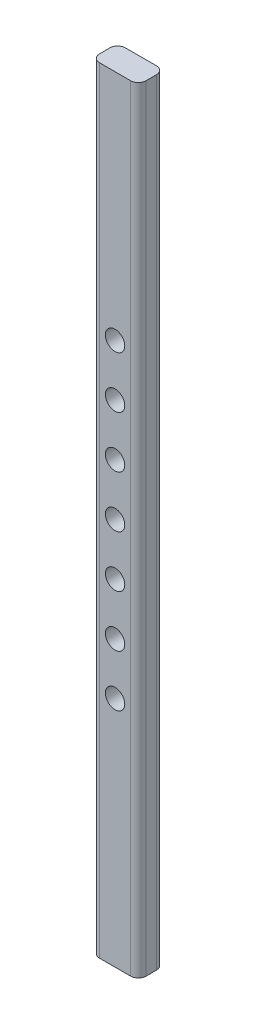
ISO-10303-21;
HEADER;
FILE_DESCRIPTION(('STEP AP214'),'2;1');
FILE_NAME('part.step','',(''),(''),'','','');
FILE_SCHEMA(('AUTOMOTIVE_DESIGN { 1 0 10303 214 1 1 1 1 }'));
ENDSEC;
DATA;
#1=APPLICATION_CONTEXT('core data for automotive mechanical design processes');
#2=APPLICATION_PROTOCOL_DEFINITION('international standard','automotive_design',2000,#1);
#3=PRODUCT_CONTEXT('',#1,'mechanical');
#4=PRODUCT('Part','Part','',(#3));
#5=PRODUCT_RELATED_PRODUCT_CATEGORY('part','',(#4));
#6=PRODUCT_DEFINITION_FORMATION('','',#4);
#7=PRODUCT_DEFINITION_CONTEXT('part definition',#1,'design');
#8=PRODUCT_DEFINITION('design','',#6,#7);
#9=PRODUCT_DEFINITION_SHAPE('','',#8);
#10=(LENGTH_UNIT() NAMED_UNIT(*) SI_UNIT(.MILLI.,.METRE.));
#11=(NAMED_UNIT(*) PLANE_ANGLE_UNIT() SI_UNIT($,.RADIAN.));
#12=(NAMED_UNIT(*) SI_UNIT($,.STERADIAN.) SOLID_ANGLE_UNIT());
#13=UNCERTAINTY_MEASURE_WITH_UNIT(LENGTH_MEASURE(1.E-05),#10,'distance_accuracy_value','');
#14=(GEOMETRIC_REPRESENTATION_CONTEXT(3) GLOBAL_UNCERTAINTY_ASSIGNED_CONTEXT((#13)) GLOBAL_UNIT_ASSIGNED_CONTEXT((#10,
#11,#12)) REPRESENTATION_CONTEXT('',''));
#15=CARTESIAN_POINT('',(0.,0.,0.));
#16=DIRECTION('',(0.,0.,1.));
#17=DIRECTION('',(1.,0.,0.));
#18=AXIS2_PLACEMENT_3D('',#15,#16,#17);
#19=CARTESIAN_POINT('',(8.99999999999998,150.,5.));
#20=DIRECTION('',(-1.,0.,0.));
#21=DIRECTION('',(0.,-1.,0.));
#22=AXIS2_PLACEMENT_3D('',#19,#20,#21);
#23=PLANE('',#22);
#24=DIRECTION('',(0.,0.,-1.));
#25=VECTOR('',#24,1.);
#26=CARTESIAN_POINT('',(8.99999999999998,150.,5.));
#27=LINE('',#26,#25);
#28=CARTESIAN_POINT('',(8.99999999999998,150.,2.));
#29=VERTEX_POINT('',#28);
#30=CARTESIAN_POINT('',(8.99999999999998,150.,-2.));
#31=VERTEX_POINT('',#30);
#32=EDGE_CURVE('E121',#29,#31,#27,.T.);
#33=ORIENTED_EDGE('',*,*,#32,.F.);
#34=DIRECTION('',(0.,1.,0.));
#35=VECTOR('',#34,1.);
#36=CARTESIAN_POINT('',(9.00000000000002,-150.,2.));
#37=LINE('',#36,#35);
#38=CARTESIAN_POINT('',(9.00000000000002,-150.,2.));
#39=VERTEX_POINT('',#38);
#40=EDGE_CURVE('E11',#29,#39,#37,.F.);
#41=ORIENTED_EDGE('',*,*,#40,.T.);
#42=DIRECTION('',(0.,0.,-1.));
#43=VECTOR('',#42,1.);
#44=CARTESIAN_POINT('',(9.00000000000002,-150.,5.));
#45=LINE('',#44,#43);
#46=CARTESIAN_POINT('',(9.00000000000002,-150.,-2.));
#47=VERTEX_POINT('',#46);
#48=EDGE_CURVE('E129',#39,#47,#45,.T.);
#49=ORIENTED_EDGE('',*,*,#48,.T.);
#50=DIRECTION('',(0.,1.,0.));
#51=VECTOR('',#50,1.);
#52=CARTESIAN_POINT('',(8.99999999999998,150.,-2.));
#53=LINE('',#52,#51);
#54=EDGE_CURVE('E47',#47,#31,#53,.T.);
#55=ORIENTED_EDGE('',*,*,#54,.T.);
#56=EDGE_LOOP('',(#33,#41,#49,#55));
#57=FACE_BOUND('',#56,.T.);
#58=ADVANCED_FACE('F39',(#57),#23,.F.);
#59=CARTESIAN_POINT('',(-9.00000000000002,150.,5.));
#60=DIRECTION('',(0.,-1.,0.));
#61=DIRECTION('',(0.,0.,-1.));
#62=AXIS2_PLACEMENT_3D('',#59,#60,#61);
#63=PLANE('',#62);
#64=DIRECTION('',(0.,0.,-1.));
#65=VECTOR('',#64,1.);
#66=CARTESIAN_POINT('',(-9.00000000000002,150.,5.));
#67=LINE('',#66,#65);
#68=CARTESIAN_POINT('',(-9.00000000000002,150.,2.));
#69=VERTEX_POINT('',#68);
#70=CARTESIAN_POINT('',(-9.00000000000002,150.,-2.));
#71=VERTEX_POINT('',#70);
#72=EDGE_CURVE('E146',#69,#71,#67,.T.);
#73=ORIENTED_EDGE('',*,*,#72,.F.);
#74=CARTESIAN_POINT('',(-6.00000000000002,150.,2.));
#75=DIRECTION('',(0.,-1.,0.));
#76=DIRECTION('',(0.,0.,-1.));
#77=AXIS2_PLACEMENT_3D('',#74,#75,#76);
#78=CIRCLE('',#77,3.);
#79=CARTESIAN_POINT('',(-6.00000000000002,150.,5.));
#80=VERTEX_POINT('',#79);
#81=EDGE_CURVE('E126',#69,#80,#78,.F.);
#82=ORIENTED_EDGE('',*,*,#81,.T.);
#83=DIRECTION('',(-1.,0.,0.));
#84=VECTOR('',#83,1.);
#85=CARTESIAN_POINT('',(-9.00000000000002,150.,5.));
#86=LINE('',#85,#84);
#87=CARTESIAN_POINT('',(5.99999999999998,150.,5.));
#88=VERTEX_POINT('',#87);
#89=EDGE_CURVE('E116',#88,#80,#86,.T.);
#90=ORIENTED_EDGE('',*,*,#89,.F.);
#91=CARTESIAN_POINT('',(5.99999999999998,150.,2.));
#92=DIRECTION('',(0.,-1.,0.));
#93=DIRECTION('',(0.,0.,-1.));
#94=AXIS2_PLACEMENT_3D('',#91,#92,#93);
#95=CIRCLE('',#94,3.);
#96=EDGE_CURVE('E62',#88,#29,#95,.F.);
#97=ORIENTED_EDGE('',*,*,#96,.T.);
#98=ORIENTED_EDGE('',*,*,#32,.T.);
#99=CARTESIAN_POINT('',(5.99999999999998,150.,-2.));
#100=DIRECTION('',(0.,-1.,0.));
#101=DIRECTION('',(0.,0.,-1.));
#102=AXIS2_PLACEMENT_3D('',#99,#100,#101);
#103=CIRCLE('',#102,3.);
#104=CARTESIAN_POINT('',(5.99999999999998,150.,-5.));
#105=VERTEX_POINT('',#104);
#106=EDGE_CURVE('E54',#31,#105,#103,.F.);
#107=ORIENTED_EDGE('',*,*,#106,.T.);
#108=DIRECTION('',(-1.,0.,0.));
#109=VECTOR('',#108,1.);
#110=CARTESIAN_POINT('',(-9.00000000000002,150.,-5.));
#111=LINE('',#110,#109);
#112=CARTESIAN_POINT('',(-6.00000000000002,150.,-5.));
#113=VERTEX_POINT('',#112);
#114=EDGE_CURVE('E132',#105,#113,#111,.T.);
#115=ORIENTED_EDGE('',*,*,#114,.T.);
#116=CARTESIAN_POINT('',(-6.00000000000002,150.,-2.));
#117=DIRECTION('',(0.,-1.,0.));
#118=DIRECTION('',(0.,0.,-1.));
#119=AXIS2_PLACEMENT_3D('',#116,#117,#118);
#120=CIRCLE('',#119,3.);
#121=EDGE_CURVE('E109',#113,#71,#120,.F.);
#122=ORIENTED_EDGE('',*,*,#121,.T.);
#123=EDGE_LOOP('',(#73,#82,#90,#97,#98,#107,#115,#122));
#124=FACE_BOUND('',#123,.T.);
#125=ADVANCED_FACE('F124',(#124),#63,.F.);
#126=CARTESIAN_POINT('',(-9.00000000000002,150.,5.));
#127=DIRECTION('',(1.,0.,0.));
#128=DIRECTION('',(0.,1.,0.));
#129=AXIS2_PLACEMENT_3D('',#126,#127,#128);
#130=PLANE('',#129);
#131=DIRECTION('',(0.,0.,-1.));
#132=VECTOR('',#131,1.);
#133=CARTESIAN_POINT('',(-8.99999999999998,-150.,5.));
#134=LINE('',#133,#132);
#135=CARTESIAN_POINT('',(-8.99999999999998,-150.,2.));
#136=VERTEX_POINT('',#135);
#137=CARTESIAN_POINT('',(-8.99999999999998,-150.,-2.));
#138=VERTEX_POINT('',#137);
#139=EDGE_CURVE('E143',#136,#138,#134,.T.);
#140=ORIENTED_EDGE('',*,*,#139,.F.);
#141=DIRECTION('',(0.,-1.,0.));
#142=VECTOR('',#141,1.);
#143=CARTESIAN_POINT('',(-9.00000000000002,150.,2.));
#144=LINE('',#143,#142);
#145=EDGE_CURVE('E162',#136,#69,#144,.F.);
#146=ORIENTED_EDGE('',*,*,#145,.T.);
#147=ORIENTED_EDGE('',*,*,#72,.T.);
#148=DIRECTION('',(0.,-1.,0.));
#149=VECTOR('',#148,1.);
#150=CARTESIAN_POINT('',(-9.00000000000002,150.,-2.));
#151=LINE('',#150,#149);
#152=EDGE_CURVE('E159',#71,#138,#151,.T.);
#153=ORIENTED_EDGE('',*,*,#152,.T.);
#154=EDGE_LOOP('',(#140,#146,#147,#153));
#155=FACE_BOUND('',#154,.T.);
#156=ADVANCED_FACE('F186',(#155),#130,.F.);
#157=CARTESIAN_POINT('',(-8.99999999999998,-150.,5.));
#158=DIRECTION('',(0.,1.,0.));
#159=DIRECTION('',(0.,0.,1.));
#160=AXIS2_PLACEMENT_3D('',#157,#158,#159);
#161=PLANE('',#160);
#162=DIRECTION('',(1.,0.,0.));
#163=VECTOR('',#162,1.);
#164=CARTESIAN_POINT('',(-8.99999999999998,-150.,5.));
#165=LINE('',#164,#163);
#166=CARTESIAN_POINT('',(-5.99999999999998,-150.,5.));
#167=VERTEX_POINT('',#166);
#168=CARTESIAN_POINT('',(6.00000000000002,-150.,5.));
#169=VERTEX_POINT('',#168);
#170=EDGE_CURVE('E119',#167,#169,#165,.T.);
#171=ORIENTED_EDGE('',*,*,#170,.F.);
#172=CARTESIAN_POINT('',(-5.99999999999998,-150.,2.));
#173=DIRECTION('',(0.,1.,0.));
#174=DIRECTION('',(0.,0.,1.));
#175=AXIS2_PLACEMENT_3D('',#172,#173,#174);
#176=CIRCLE('',#175,3.);
#177=EDGE_CURVE('E157',#167,#136,#176,.F.);
#178=ORIENTED_EDGE('',*,*,#177,.T.);
#179=ORIENTED_EDGE('',*,*,#139,.T.);
#180=CARTESIAN_POINT('',(-5.99999999999998,-150.,-2.));
#181=DIRECTION('',(0.,1.,0.));
#182=DIRECTION('',(0.,0.,1.));
#183=AXIS2_PLACEMENT_3D('',#180,#181,#182);
#184=CIRCLE('',#183,3.);
#185=CARTESIAN_POINT('',(-5.99999999999998,-150.,-5.));
#186=VERTEX_POINT('',#185);
#187=EDGE_CURVE('E155',#138,#186,#184,.F.);
#188=ORIENTED_EDGE('',*,*,#187,.T.);
#189=DIRECTION('',(1.,0.,0.));
#190=VECTOR('',#189,1.);
#191=CARTESIAN_POINT('',(-8.99999999999998,-150.,-5.));
#192=LINE('',#191,#190);
#193=CARTESIAN_POINT('',(6.00000000000002,-150.,-5.));
#194=VERTEX_POINT('',#193);
#195=EDGE_CURVE('E127',#186,#194,#192,.T.);
#196=ORIENTED_EDGE('',*,*,#195,.T.);
#197=CARTESIAN_POINT('',(6.00000000000002,-150.,-2.));
#198=DIRECTION('',(0.,1.,0.));
#199=DIRECTION('',(0.,0.,1.));
#200=AXIS2_PLACEMENT_3D('',#197,#198,#199);
#201=CIRCLE('',#200,3.);
#202=EDGE_CURVE('E151',#194,#47,#201,.F.);
#203=ORIENTED_EDGE('',*,*,#202,.T.);
#204=ORIENTED_EDGE('',*,*,#48,.F.);
#205=CARTESIAN_POINT('',(6.00000000000002,-150.,2.));
#206=DIRECTION('',(0.,1.,0.));
#207=DIRECTION('',(0.,0.,1.));
#208=AXIS2_PLACEMENT_3D('',#205,#206,#207);
#209=CIRCLE('',#208,3.);
#210=EDGE_CURVE('E153',#39,#169,#209,.F.);
#211=ORIENTED_EDGE('',*,*,#210,.T.);
#212=EDGE_LOOP('',(#171,#178,#179,#188,#196,#203,#204,#211));
#213=FACE_BOUND('',#212,.T.);
#214=ADVANCED_FACE('F180',(#213),#161,.F.);
#215=CARTESIAN_POINT('',(0.,0.,5.));
#216=DIRECTION('',(0.,0.,1.));
#217=DIRECTION('',(1.,0.,0.));
#218=AXIS2_PLACEMENT_3D('',#215,#216,#217);
#219=PLANE('',#218);
#220=CARTESIAN_POINT('',(0.,60.,5.));
#221=DIRECTION('',(0.,0.,1.));
#222=DIRECTION('',(1.,0.,0.));
#223=AXIS2_PLACEMENT_3D('',#220,#221,#222);
#224=CIRCLE('',#223,3.7479174169822);
#225=CARTESIAN_POINT('',(3.74791741698219,60.,5.));
#226=VERTEX_POINT('',#225);
#227=EDGE_CURVE('E247',#226,#226,#224,.T.);
#228=ORIENTED_EDGE('',*,*,#227,.F.);
#229=EDGE_LOOP('',(#228));
#230=FACE_BOUND('',#229,.T.);
#231=CARTESIAN_POINT('',(0.,40.,5.));
#232=DIRECTION('',(0.,0.,1.));
#233=DIRECTION('',(1.,0.,0.));
#234=AXIS2_PLACEMENT_3D('',#231,#232,#233);
#235=CIRCLE('',#234,3.7479174169822);
#236=CARTESIAN_POINT('',(3.74791741698219,40.,5.));
#237=VERTEX_POINT('',#236);
#238=EDGE_CURVE('E248',#237,#237,#235,.T.);
#239=ORIENTED_EDGE('',*,*,#238,.F.);
#240=EDGE_LOOP('',(#239));
#241=FACE_BOUND('',#240,.T.);
#242=CARTESIAN_POINT('',(0.,20.,5.));
#243=DIRECTION('',(0.,0.,1.));
#244=DIRECTION('',(1.,0.,0.));
#245=AXIS2_PLACEMENT_3D('',#242,#243,#244);
#246=CIRCLE('',#245,3.7479174169822);
#247=CARTESIAN_POINT('',(3.74791741698219,20.,5.));
#248=VERTEX_POINT('',#247);
#249=EDGE_CURVE('E257',#248,#248,#246,.T.);
#250=ORIENTED_EDGE('',*,*,#249,.F.);
#251=EDGE_LOOP('',(#250));
#252=FACE_BOUND('',#251,.T.);
#253=CARTESIAN_POINT('',(0.,0.,5.));
#254=DIRECTION('',(0.,0.,1.));
#255=DIRECTION('',(1.,0.,0.));
#256=AXIS2_PLACEMENT_3D('',#253,#254,#255);
#257=CIRCLE('',#256,3.7479174169822);
#258=CARTESIAN_POINT('',(3.7479174169822,0.,5.));
#259=VERTEX_POINT('',#258);
#260=EDGE_CURVE('E263',#259,#259,#257,.T.);
#261=ORIENTED_EDGE('',*,*,#260,.F.);
#262=EDGE_LOOP('',(#261));
#263=FACE_BOUND('',#262,.T.);
#264=CARTESIAN_POINT('',(0.,-20.,5.));
#265=DIRECTION('',(0.,0.,1.));
#266=DIRECTION('',(1.,0.,0.));
#267=AXIS2_PLACEMENT_3D('',#264,#265,#266);
#268=CIRCLE('',#267,3.7479174169822);
#269=CARTESIAN_POINT('',(3.7479174169822,-20.,5.));
#270=VERTEX_POINT('',#269);
#271=EDGE_CURVE('E269',#270,#270,#268,.T.);
#272=ORIENTED_EDGE('',*,*,#271,.F.);
#273=EDGE_LOOP('',(#272));
#274=FACE_BOUND('',#273,.T.);
#275=CARTESIAN_POINT('',(0.,-40.,5.));
#276=DIRECTION('',(0.,0.,1.));
#277=DIRECTION('',(1.,0.,0.));
#278=AXIS2_PLACEMENT_3D('',#275,#276,#277);
#279=CIRCLE('',#278,3.7479174169822);
#280=CARTESIAN_POINT('',(3.7479174169822,-40.,5.));
#281=VERTEX_POINT('',#280);
#282=EDGE_CURVE('E275',#281,#281,#279,.T.);
#283=ORIENTED_EDGE('',*,*,#282,.F.);
#284=EDGE_LOOP('',(#283));
#285=FACE_BOUND('',#284,.T.);
#286=CARTESIAN_POINT('',(0.,-60.,5.));
#287=DIRECTION('',(0.,0.,1.));
#288=DIRECTION('',(1.,0.,0.));
#289=AXIS2_PLACEMENT_3D('',#286,#287,#288);
#290=CIRCLE('',#289,3.7479174169822);
#291=CARTESIAN_POINT('',(3.7479174169822,-60.,5.));
#292=VERTEX_POINT('',#291);
#293=EDGE_CURVE('E280',#292,#292,#290,.T.);
#294=ORIENTED_EDGE('',*,*,#293,.F.);
#295=EDGE_LOOP('',(#294));
#296=FACE_BOUND('',#295,.T.);
#297=ORIENTED_EDGE('',*,*,#89,.T.);
#298=DIRECTION('',(0.,-1.,0.));
#299=VECTOR('',#298,1.);
#300=CARTESIAN_POINT('',(-5.99999999999998,-150.,5.));
#301=LINE('',#300,#299);
#302=EDGE_CURVE('E120',#80,#167,#301,.T.);
#303=ORIENTED_EDGE('',*,*,#302,.T.);
#304=ORIENTED_EDGE('',*,*,#170,.T.);
#305=DIRECTION('',(0.,1.,0.));
#306=VECTOR('',#305,1.);
#307=CARTESIAN_POINT('',(5.99999999999998,150.,5.));
#308=LINE('',#307,#306);
#309=EDGE_CURVE('E108',#169,#88,#308,.T.);
#310=ORIENTED_EDGE('',*,*,#309,.T.);
#311=EDGE_LOOP('',(#297,#303,#304,#310));
#312=FACE_BOUND('',#311,.T.);
#313=ADVANCED_FACE('F114',(#230,#241,#252,#263,#274,#285,#296,#312),#219,.T.);
#314=CARTESIAN_POINT('',(0.,0.,-5.));
#315=DIRECTION('',(0.,0.,1.));
#316=DIRECTION('',(1.,0.,0.));
#317=AXIS2_PLACEMENT_3D('',#314,#315,#316);
#318=PLANE('',#317);
#319=CARTESIAN_POINT('',(0.,60.,-5.));
#320=DIRECTION('',(0.,0.,1.));
#321=DIRECTION('',(1.,0.,0.));
#322=AXIS2_PLACEMENT_3D('',#319,#320,#321);
#323=CIRCLE('',#322,3.7479174169822);
#324=CARTESIAN_POINT('',(3.74791741698219,60.,-5.));
#325=VERTEX_POINT('',#324);
#326=EDGE_CURVE('E139',#325,#325,#323,.T.);
#327=ORIENTED_EDGE('',*,*,#326,.T.);
#328=EDGE_LOOP('',(#327));
#329=FACE_BOUND('',#328,.T.);
#330=CARTESIAN_POINT('',(0.,40.,-5.));
#331=DIRECTION('',(0.,0.,1.));
#332=DIRECTION('',(1.,0.,0.));
#333=AXIS2_PLACEMENT_3D('',#330,#331,#332);
#334=CIRCLE('',#333,3.7479174169822);
#335=CARTESIAN_POINT('',(3.74791741698219,40.,-5.));
#336=VERTEX_POINT('',#335);
#337=EDGE_CURVE('E252',#336,#336,#334,.T.);
#338=ORIENTED_EDGE('',*,*,#337,.T.);
#339=EDGE_LOOP('',(#338));
#340=FACE_BOUND('',#339,.T.);
#341=CARTESIAN_POINT('',(0.,20.,-5.));
#342=DIRECTION('',(0.,0.,1.));
#343=DIRECTION('',(1.,0.,0.));
#344=AXIS2_PLACEMENT_3D('',#341,#342,#343);
#345=CIRCLE('',#344,3.7479174169822);
#346=CARTESIAN_POINT('',(3.74791741698219,20.,-5.));
#347=VERTEX_POINT('',#346);
#348=EDGE_CURVE('E260',#347,#347,#345,.T.);
#349=ORIENTED_EDGE('',*,*,#348,.T.);
#350=EDGE_LOOP('',(#349));
#351=FACE_BOUND('',#350,.T.);
#352=CARTESIAN_POINT('',(0.,0.,-5.));
#353=DIRECTION('',(0.,0.,1.));
#354=DIRECTION('',(1.,0.,0.));
#355=AXIS2_PLACEMENT_3D('',#352,#353,#354);
#356=CIRCLE('',#355,3.7479174169822);
#357=CARTESIAN_POINT('',(3.7479174169822,0.,-5.));
#358=VERTEX_POINT('',#357);
#359=EDGE_CURVE('E266',#358,#358,#356,.T.);
#360=ORIENTED_EDGE('',*,*,#359,.T.);
#361=EDGE_LOOP('',(#360));
#362=FACE_BOUND('',#361,.T.);
#363=CARTESIAN_POINT('',(0.,-20.,-5.));
#364=DIRECTION('',(0.,0.,1.));
#365=DIRECTION('',(1.,0.,0.));
#366=AXIS2_PLACEMENT_3D('',#363,#364,#365);
#367=CIRCLE('',#366,3.7479174169822);
#368=CARTESIAN_POINT('',(3.7479174169822,-20.,-5.));
#369=VERTEX_POINT('',#368);
#370=EDGE_CURVE('E272',#369,#369,#367,.T.);
#371=ORIENTED_EDGE('',*,*,#370,.T.);
#372=EDGE_LOOP('',(#371));
#373=FACE_BOUND('',#372,.T.);
#374=CARTESIAN_POINT('',(0.,-40.,-5.));
#375=DIRECTION('',(0.,0.,1.));
#376=DIRECTION('',(1.,0.,0.));
#377=AXIS2_PLACEMENT_3D('',#374,#375,#376);
#378=CIRCLE('',#377,3.7479174169822);
#379=CARTESIAN_POINT('',(3.7479174169822,-40.,-5.));
#380=VERTEX_POINT('',#379);
#381=EDGE_CURVE('E278',#380,#380,#378,.T.);
#382=ORIENTED_EDGE('',*,*,#381,.T.);
#383=EDGE_LOOP('',(#382));
#384=FACE_BOUND('',#383,.T.);
#385=CARTESIAN_POINT('',(0.,-60.,-5.));
#386=DIRECTION('',(0.,0.,1.));
#387=DIRECTION('',(1.,0.,0.));
#388=AXIS2_PLACEMENT_3D('',#385,#386,#387);
#389=CIRCLE('',#388,3.7479174169822);
#390=CARTESIAN_POINT('',(3.7479174169822,-60.,-5.));
#391=VERTEX_POINT('',#390);
#392=EDGE_CURVE('E135',#391,#391,#389,.T.);
#393=ORIENTED_EDGE('',*,*,#392,.T.);
#394=EDGE_LOOP('',(#393));
#395=FACE_BOUND('',#394,.T.);
#396=ORIENTED_EDGE('',*,*,#195,.F.);
#397=DIRECTION('',(0.,-1.,0.));
#398=VECTOR('',#397,1.);
#399=CARTESIAN_POINT('',(-6.,0.,-5.));
#400=LINE('',#399,#398);
#401=EDGE_CURVE('E169',#186,#113,#400,.F.);
#402=ORIENTED_EDGE('',*,*,#401,.T.);
#403=ORIENTED_EDGE('',*,*,#114,.F.);
#404=DIRECTION('',(0.,1.,0.));
#405=VECTOR('',#404,1.);
#406=CARTESIAN_POINT('',(6.,0.,-5.));
#407=LINE('',#406,#405);
#408=EDGE_CURVE('E167',#105,#194,#407,.F.);
#409=ORIENTED_EDGE('',*,*,#408,.T.);
#410=EDGE_LOOP('',(#396,#402,#403,#409));
#411=FACE_BOUND('',#410,.T.);
#412=ADVANCED_FACE('F177',(#329,#340,#351,#362,#373,#384,#395,#411),#318,.F.);
#413=CARTESIAN_POINT('',(-6.,0.,2.));
#414=DIRECTION('',(0.,1.,0.));
#415=DIRECTION('',(-1.,0.,0.));
#416=AXIS2_PLACEMENT_3D('',#413,#414,#415);
#417=CYLINDRICAL_SURFACE('',#416,3.);
#418=ORIENTED_EDGE('',*,*,#81,.F.);
#419=ORIENTED_EDGE('',*,*,#145,.F.);
#420=ORIENTED_EDGE('',*,*,#177,.F.);
#421=ORIENTED_EDGE('',*,*,#302,.F.);
#422=EDGE_LOOP('',(#418,#419,#420,#421));
#423=FACE_BOUND('',#422,.T.);
#424=ADVANCED_FACE('F189',(#423),#417,.T.);
#425=CARTESIAN_POINT('',(-6.00000000000002,150.,-2.));
#426=DIRECTION('',(0.,-1.,0.));
#427=DIRECTION('',(1.,0.,0.));
#428=AXIS2_PLACEMENT_3D('',#425,#426,#427);
#429=CYLINDRICAL_SURFACE('',#428,3.);
#430=ORIENTED_EDGE('',*,*,#121,.F.);
#431=ORIENTED_EDGE('',*,*,#401,.F.);
#432=ORIENTED_EDGE('',*,*,#187,.F.);
#433=ORIENTED_EDGE('',*,*,#152,.F.);
#434=EDGE_LOOP('',(#430,#431,#432,#433));
#435=FACE_BOUND('',#434,.T.);
#436=ADVANCED_FACE('F182',(#435),#429,.T.);
#437=CARTESIAN_POINT('',(6.,0.,2.));
#438=DIRECTION('',(0.,-1.,0.));
#439=DIRECTION('',(1.,0.,0.));
#440=AXIS2_PLACEMENT_3D('',#437,#438,#439);
#441=CYLINDRICAL_SURFACE('',#440,3.);
#442=ORIENTED_EDGE('',*,*,#210,.F.);
#443=ORIENTED_EDGE('',*,*,#40,.F.);
#444=ORIENTED_EDGE('',*,*,#96,.F.);
#445=ORIENTED_EDGE('',*,*,#309,.F.);
#446=EDGE_LOOP('',(#442,#443,#444,#445));
#447=FACE_BOUND('',#446,.T.);
#448=ADVANCED_FACE('F107',(#447),#441,.T.);
#449=CARTESIAN_POINT('',(5.99999999999998,150.,-2.));
#450=DIRECTION('',(0.,1.,0.));
#451=DIRECTION('',(-1.,0.,0.));
#452=AXIS2_PLACEMENT_3D('',#449,#450,#451);
#453=CYLINDRICAL_SURFACE('',#452,3.);
#454=ORIENTED_EDGE('',*,*,#202,.F.);
#455=ORIENTED_EDGE('',*,*,#408,.F.);
#456=ORIENTED_EDGE('',*,*,#106,.F.);
#457=ORIENTED_EDGE('',*,*,#54,.F.);
#458=EDGE_LOOP('',(#454,#455,#456,#457));
#459=FACE_BOUND('',#458,.T.);
#460=ADVANCED_FACE('F41',(#459),#453,.T.);
#461=CARTESIAN_POINT('',(0.,-60.,-5.));
#462=DIRECTION('',(0.,0.,1.));
#463=DIRECTION('',(1.,0.,0.));
#464=AXIS2_PLACEMENT_3D('',#461,#462,#463);
#465=CYLINDRICAL_SURFACE('',#464,3.7479174169822);
#466=ORIENTED_EDGE('',*,*,#392,.F.);
#467=EDGE_LOOP('',(#466));
#468=FACE_BOUND('',#467,.T.);
#469=ORIENTED_EDGE('',*,*,#293,.T.);
#470=EDGE_LOOP('',(#469));
#471=FACE_BOUND('',#470,.T.);
#472=ADVANCED_FACE('F213',(#468,#471),#465,.F.);
#473=CARTESIAN_POINT('',(0.,-40.,-5.));
#474=DIRECTION('',(0.,0.,1.));
#475=DIRECTION('',(1.,0.,0.));
#476=AXIS2_PLACEMENT_3D('',#473,#474,#475);
#477=CYLINDRICAL_SURFACE('',#476,3.7479174169822);
#478=ORIENTED_EDGE('',*,*,#381,.F.);
#479=EDGE_LOOP('',(#478));
#480=FACE_BOUND('',#479,.T.);
#481=ORIENTED_EDGE('',*,*,#282,.T.);
#482=EDGE_LOOP('',(#481));
#483=FACE_BOUND('',#482,.T.);
#484=ADVANCED_FACE('F216',(#480,#483),#477,.F.);
#485=CARTESIAN_POINT('',(0.,-20.,-5.));
#486=DIRECTION('',(0.,0.,1.));
#487=DIRECTION('',(1.,0.,0.));
#488=AXIS2_PLACEMENT_3D('',#485,#486,#487);
#489=CYLINDRICAL_SURFACE('',#488,3.7479174169822);
#490=ORIENTED_EDGE('',*,*,#370,.F.);
#491=EDGE_LOOP('',(#490));
#492=FACE_BOUND('',#491,.T.);
#493=ORIENTED_EDGE('',*,*,#271,.T.);
#494=EDGE_LOOP('',(#493));
#495=FACE_BOUND('',#494,.T.);
#496=ADVANCED_FACE('F220',(#492,#495),#489,.F.);
#497=CARTESIAN_POINT('',(0.,0.,-5.));
#498=DIRECTION('',(0.,0.,1.));
#499=DIRECTION('',(1.,0.,0.));
#500=AXIS2_PLACEMENT_3D('',#497,#498,#499);
#501=CYLINDRICAL_SURFACE('',#500,3.7479174169822);
#502=ORIENTED_EDGE('',*,*,#359,.F.);
#503=EDGE_LOOP('',(#502));
#504=FACE_BOUND('',#503,.T.);
#505=ORIENTED_EDGE('',*,*,#260,.T.);
#506=EDGE_LOOP('',(#505));
#507=FACE_BOUND('',#506,.T.);
#508=ADVANCED_FACE('F224',(#504,#507),#501,.F.);
#509=CARTESIAN_POINT('',(0.,20.,-5.));
#510=DIRECTION('',(0.,0.,1.));
#511=DIRECTION('',(1.,0.,0.));
#512=AXIS2_PLACEMENT_3D('',#509,#510,#511);
#513=CYLINDRICAL_SURFACE('',#512,3.7479174169822);
#514=ORIENTED_EDGE('',*,*,#348,.F.);
#515=EDGE_LOOP('',(#514));
#516=FACE_BOUND('',#515,.T.);
#517=ORIENTED_EDGE('',*,*,#249,.T.);
#518=EDGE_LOOP('',(#517));
#519=FACE_BOUND('',#518,.T.);
#520=ADVANCED_FACE('F228',(#516,#519),#513,.F.);
#521=CARTESIAN_POINT('',(0.,40.,-5.));
#522=DIRECTION('',(0.,0.,1.));
#523=DIRECTION('',(1.,0.,0.));
#524=AXIS2_PLACEMENT_3D('',#521,#522,#523);
#525=CYLINDRICAL_SURFACE('',#524,3.7479174169822);
#526=ORIENTED_EDGE('',*,*,#337,.F.);
#527=EDGE_LOOP('',(#526));
#528=FACE_BOUND('',#527,.T.);
#529=ORIENTED_EDGE('',*,*,#238,.T.);
#530=EDGE_LOOP('',(#529));
#531=FACE_BOUND('',#530,.T.);
#532=ADVANCED_FACE('F232',(#528,#531),#525,.F.);
#533=CARTESIAN_POINT('',(0.,60.,-5.));
#534=DIRECTION('',(0.,0.,1.));
#535=DIRECTION('',(1.,0.,0.));
#536=AXIS2_PLACEMENT_3D('',#533,#534,#535);
#537=CYLINDRICAL_SURFACE('',#536,3.7479174169822);
#538=ORIENTED_EDGE('',*,*,#326,.F.);
#539=EDGE_LOOP('',(#538));
#540=FACE_BOUND('',#539,.T.);
#541=ORIENTED_EDGE('',*,*,#227,.T.);
#542=EDGE_LOOP('',(#541));
#543=FACE_BOUND('',#542,.T.);
#544=ADVANCED_FACE('F236',(#540,#543),#537,.F.);
#545=CLOSED_SHELL('',(#58,#125,#156,#214,#313,#412,#424,#436,#448,#460,#472,#484,#496,#508,#520,
#532,#544));
#546=MANIFOLD_SOLID_BREP('B2',#545);
#547=ADVANCED_BREP_SHAPE_REPRESENTATION('',(#18,#546),#14);
#548=SHAPE_DEFINITION_REPRESENTATION(#9,#547);
ENDSEC;
END-ISO-10303-21;
